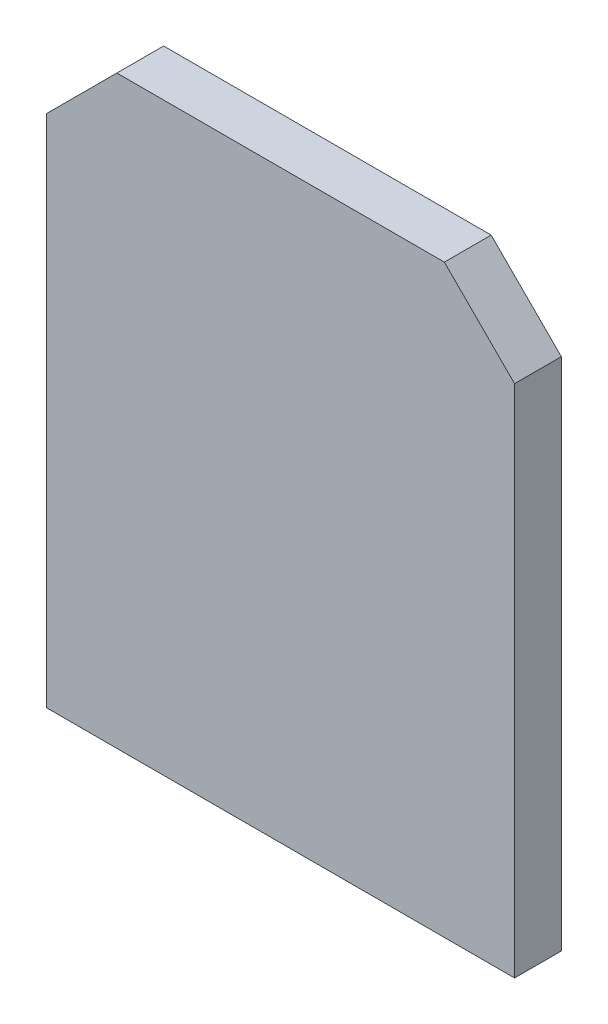
ISO-10303-21;
HEADER;
FILE_DESCRIPTION(('STEP AP214'),'2;1');
FILE_NAME('part.step','',(''),(''),'','','');
FILE_SCHEMA(('AUTOMOTIVE_DESIGN { 1 0 10303 214 1 1 1 1 }'));
ENDSEC;
DATA;
#1=APPLICATION_CONTEXT('core data for automotive mechanical design processes');
#2=APPLICATION_PROTOCOL_DEFINITION('international standard','automotive_design',2000,#1);
#3=PRODUCT_CONTEXT('',#1,'mechanical');
#4=PRODUCT('Part','Part','',(#3));
#5=PRODUCT_RELATED_PRODUCT_CATEGORY('part','',(#4));
#6=PRODUCT_DEFINITION_FORMATION('','',#4);
#7=PRODUCT_DEFINITION_CONTEXT('part definition',#1,'design');
#8=PRODUCT_DEFINITION('design','',#6,#7);
#9=PRODUCT_DEFINITION_SHAPE('','',#8);
#10=(LENGTH_UNIT() NAMED_UNIT(*) SI_UNIT(.MILLI.,.METRE.));
#11=(NAMED_UNIT(*) PLANE_ANGLE_UNIT() SI_UNIT($,.RADIAN.));
#12=(NAMED_UNIT(*) SI_UNIT($,.STERADIAN.) SOLID_ANGLE_UNIT());
#13=UNCERTAINTY_MEASURE_WITH_UNIT(LENGTH_MEASURE(1.E-05),#10,'distance_accuracy_value','');
#14=(GEOMETRIC_REPRESENTATION_CONTEXT(3) GLOBAL_UNCERTAINTY_ASSIGNED_CONTEXT((#13)) GLOBAL_UNIT_ASSIGNED_CONTEXT((#10,
#11,#12)) REPRESENTATION_CONTEXT('',''));
#15=CARTESIAN_POINT('',(0.,0.,0.));
#16=DIRECTION('',(0.,0.,1.));
#17=DIRECTION('',(1.,0.,0.));
#18=AXIS2_PLACEMENT_3D('',#15,#16,#17);
#19=CARTESIAN_POINT('',(-25.4,-31.75,5.08));
#20=DIRECTION('',(1.,0.,0.));
#21=DIRECTION('',(0.,0.,-1.));
#22=AXIS2_PLACEMENT_3D('',#19,#20,#21);
#23=PLANE('',#22);
#24=DIRECTION('',(0.,-1.,0.));
#25=VECTOR('',#24,1.);
#26=CARTESIAN_POINT('',(-25.4,-31.75,0.));
#27=LINE('',#26,#25);
#28=CARTESIAN_POINT('',(-25.4,24.13,0.));
#29=VERTEX_POINT('',#28);
#30=CARTESIAN_POINT('',(-25.4,-31.75,0.));
#31=VERTEX_POINT('',#30);
#32=EDGE_CURVE('E117',#29,#31,#27,.T.);
#33=ORIENTED_EDGE('',*,*,#32,.T.);
#34=DIRECTION('',(0.,0.,-1.));
#35=VECTOR('',#34,1.);
#36=CARTESIAN_POINT('',(-25.4,-31.75,5.08));
#37=LINE('',#36,#35);
#38=CARTESIAN_POINT('',(-25.4,-31.75,5.08));
#39=VERTEX_POINT('',#38);
#40=EDGE_CURVE('E11',#39,#31,#37,.T.);
#41=ORIENTED_EDGE('',*,*,#40,.F.);
#42=DIRECTION('',(0.,-1.,0.));
#43=VECTOR('',#42,1.);
#44=CARTESIAN_POINT('',(-25.4,-31.75,5.08));
#45=LINE('',#44,#43);
#46=CARTESIAN_POINT('',(-25.4,24.13,5.08));
#47=VERTEX_POINT('',#46);
#48=EDGE_CURVE('E127',#47,#39,#45,.T.);
#49=ORIENTED_EDGE('',*,*,#48,.F.);
#50=DIRECTION('',(0.,0.,-1.));
#51=VECTOR('',#50,1.);
#52=CARTESIAN_POINT('',(-25.4,24.13,5.08));
#53=LINE('',#52,#51);
#54=EDGE_CURVE('E113',#47,#29,#53,.T.);
#55=ORIENTED_EDGE('',*,*,#54,.T.);
#56=EDGE_LOOP('',(#33,#41,#49,#55));
#57=FACE_BOUND('',#56,.T.);
#58=ADVANCED_FACE('F33',(#57),#23,.F.);
#59=CARTESIAN_POINT('',(-25.4,-31.75,5.08));
#60=DIRECTION('',(0.,1.,0.));
#61=DIRECTION('',(0.,0.,1.));
#62=AXIS2_PLACEMENT_3D('',#59,#60,#61);
#63=PLANE('',#62);
#64=DIRECTION('',(1.,0.,0.));
#65=VECTOR('',#64,1.);
#66=CARTESIAN_POINT('',(-25.4,-31.75,0.));
#67=LINE('',#66,#65);
#68=CARTESIAN_POINT('',(25.4,-31.75,0.));
#69=VERTEX_POINT('',#68);
#70=EDGE_CURVE('E120',#31,#69,#67,.T.);
#71=ORIENTED_EDGE('',*,*,#70,.T.);
#72=DIRECTION('',(0.,0.,-1.));
#73=VECTOR('',#72,1.);
#74=CARTESIAN_POINT('',(25.4,-31.75,5.08));
#75=LINE('',#74,#73);
#76=CARTESIAN_POINT('',(25.4,-31.75,5.08));
#77=VERTEX_POINT('',#76);
#78=EDGE_CURVE('E41',#77,#69,#75,.T.);
#79=ORIENTED_EDGE('',*,*,#78,.F.);
#80=DIRECTION('',(1.,0.,0.));
#81=VECTOR('',#80,1.);
#82=CARTESIAN_POINT('',(-25.4,-31.75,5.08));
#83=LINE('',#82,#81);
#84=EDGE_CURVE('E86',#39,#77,#83,.T.);
#85=ORIENTED_EDGE('',*,*,#84,.F.);
#86=ORIENTED_EDGE('',*,*,#40,.T.);
#87=EDGE_LOOP('',(#71,#79,#85,#86));
#88=FACE_BOUND('',#87,.T.);
#89=ADVANCED_FACE('F151',(#88),#63,.F.);
#90=CARTESIAN_POINT('',(25.4,-31.75,5.08));
#91=DIRECTION('',(-1.,0.,0.));
#92=DIRECTION('',(0.,0.,1.));
#93=AXIS2_PLACEMENT_3D('',#90,#91,#92);
#94=PLANE('',#93);
#95=DIRECTION('',(0.,1.,0.));
#96=VECTOR('',#95,1.);
#97=CARTESIAN_POINT('',(25.4,-31.75,0.));
#98=LINE('',#97,#96);
#99=CARTESIAN_POINT('',(25.4,24.13,0.));
#100=VERTEX_POINT('',#99);
#101=EDGE_CURVE('E122',#69,#100,#98,.T.);
#102=ORIENTED_EDGE('',*,*,#101,.T.);
#103=DIRECTION('',(0.,0.,-1.));
#104=VECTOR('',#103,1.);
#105=CARTESIAN_POINT('',(25.4,24.13,5.08));
#106=LINE('',#105,#104);
#107=CARTESIAN_POINT('',(25.4,24.13,5.08));
#108=VERTEX_POINT('',#107);
#109=EDGE_CURVE('E108',#108,#100,#106,.T.);
#110=ORIENTED_EDGE('',*,*,#109,.F.);
#111=DIRECTION('',(0.,1.,0.));
#112=VECTOR('',#111,1.);
#113=CARTESIAN_POINT('',(25.4,-31.75,5.08));
#114=LINE('',#113,#112);
#115=EDGE_CURVE('E99',#77,#108,#114,.T.);
#116=ORIENTED_EDGE('',*,*,#115,.F.);
#117=ORIENTED_EDGE('',*,*,#78,.T.);
#118=EDGE_LOOP('',(#102,#110,#116,#117));
#119=FACE_BOUND('',#118,.T.);
#120=ADVANCED_FACE('F133',(#119),#94,.F.);
#121=CARTESIAN_POINT('',(17.78,31.75,5.08));
#122=DIRECTION('',(-0.707106781186548,-0.707106781186548,0.));
#123=DIRECTION('',(0.707106781186548,-0.707106781186548,0.));
#124=AXIS2_PLACEMENT_3D('',#121,#122,#123);
#125=PLANE('',#124);
#126=DIRECTION('',(-0.707106781186547,0.707106781186547,0.));
#127=VECTOR('',#126,1.);
#128=CARTESIAN_POINT('',(17.78,31.75,0.));
#129=LINE('',#128,#127);
#130=CARTESIAN_POINT('',(17.78,31.75,0.));
#131=VERTEX_POINT('',#130);
#132=EDGE_CURVE('E107',#100,#131,#129,.T.);
#133=ORIENTED_EDGE('',*,*,#132,.T.);
#134=DIRECTION('',(0.,0.,-1.));
#135=VECTOR('',#134,1.);
#136=CARTESIAN_POINT('',(17.78,31.75,5.08));
#137=LINE('',#136,#135);
#138=CARTESIAN_POINT('',(17.78,31.75,5.08));
#139=VERTEX_POINT('',#138);
#140=EDGE_CURVE('E104',#139,#131,#137,.T.);
#141=ORIENTED_EDGE('',*,*,#140,.F.);
#142=DIRECTION('',(-0.707106781186547,0.707106781186547,0.));
#143=VECTOR('',#142,1.);
#144=CARTESIAN_POINT('',(17.78,31.75,5.08));
#145=LINE('',#144,#143);
#146=EDGE_CURVE('E93',#108,#139,#145,.T.);
#147=ORIENTED_EDGE('',*,*,#146,.F.);
#148=ORIENTED_EDGE('',*,*,#109,.T.);
#149=EDGE_LOOP('',(#133,#141,#147,#148));
#150=FACE_BOUND('',#149,.T.);
#151=ADVANCED_FACE('F105',(#150),#125,.F.);
#152=CARTESIAN_POINT('',(-17.78,31.75,5.08));
#153=DIRECTION('',(0.,-1.,0.));
#154=DIRECTION('',(0.,0.,-1.));
#155=AXIS2_PLACEMENT_3D('',#152,#153,#154);
#156=PLANE('',#155);
#157=DIRECTION('',(-1.,0.,0.));
#158=VECTOR('',#157,1.);
#159=CARTESIAN_POINT('',(-17.78,31.75,0.));
#160=LINE('',#159,#158);
#161=CARTESIAN_POINT('',(-17.78,31.75,0.));
#162=VERTEX_POINT('',#161);
#163=EDGE_CURVE('E72',#131,#162,#160,.T.);
#164=ORIENTED_EDGE('',*,*,#163,.T.);
#165=DIRECTION('',(0.,0.,-1.));
#166=VECTOR('',#165,1.);
#167=CARTESIAN_POINT('',(-17.78,31.75,5.08));
#168=LINE('',#167,#166);
#169=CARTESIAN_POINT('',(-17.78,31.75,5.08));
#170=VERTEX_POINT('',#169);
#171=EDGE_CURVE('E109',#170,#162,#168,.T.);
#172=ORIENTED_EDGE('',*,*,#171,.F.);
#173=DIRECTION('',(-1.,0.,0.));
#174=VECTOR('',#173,1.);
#175=CARTESIAN_POINT('',(-17.78,31.75,5.08));
#176=LINE('',#175,#174);
#177=EDGE_CURVE('E97',#139,#170,#176,.T.);
#178=ORIENTED_EDGE('',*,*,#177,.F.);
#179=ORIENTED_EDGE('',*,*,#140,.T.);
#180=EDGE_LOOP('',(#164,#172,#178,#179));
#181=FACE_BOUND('',#180,.T.);
#182=ADVANCED_FACE('F111',(#181),#156,.F.);
#183=CARTESIAN_POINT('',(-25.4,24.13,5.08));
#184=DIRECTION('',(0.707106781186548,-0.707106781186548,0.));
#185=DIRECTION('',(0.707106781186548,0.707106781186548,0.));
#186=AXIS2_PLACEMENT_3D('',#183,#184,#185);
#187=PLANE('',#186);
#188=DIRECTION('',(-0.707106781186547,-0.707106781186547,0.));
#189=VECTOR('',#188,1.);
#190=CARTESIAN_POINT('',(-25.4,24.13,0.));
#191=LINE('',#190,#189);
#192=EDGE_CURVE('E78',#162,#29,#191,.T.);
#193=ORIENTED_EDGE('',*,*,#192,.T.);
#194=ORIENTED_EDGE('',*,*,#54,.F.);
#195=DIRECTION('',(-0.707106781186547,-0.707106781186547,0.));
#196=VECTOR('',#195,1.);
#197=CARTESIAN_POINT('',(-25.4,24.13,5.08));
#198=LINE('',#197,#196);
#199=EDGE_CURVE('E49',#170,#47,#198,.T.);
#200=ORIENTED_EDGE('',*,*,#199,.F.);
#201=ORIENTED_EDGE('',*,*,#171,.T.);
#202=EDGE_LOOP('',(#193,#194,#200,#201));
#203=FACE_BOUND('',#202,.T.);
#204=ADVANCED_FACE('F140',(#203),#187,.F.);
#205=CARTESIAN_POINT('',(0.,0.,5.08));
#206=DIRECTION('',(0.,0.,-1.));
#207=DIRECTION('',(-1.,0.,0.));
#208=AXIS2_PLACEMENT_3D('',#205,#206,#207);
#209=PLANE('',#208);
#210=ORIENTED_EDGE('',*,*,#48,.T.);
#211=ORIENTED_EDGE('',*,*,#84,.T.);
#212=ORIENTED_EDGE('',*,*,#115,.T.);
#213=ORIENTED_EDGE('',*,*,#146,.T.);
#214=ORIENTED_EDGE('',*,*,#177,.T.);
#215=ORIENTED_EDGE('',*,*,#199,.T.);
#216=EDGE_LOOP('',(#210,#211,#212,#213,#214,#215));
#217=FACE_BOUND('',#216,.T.);
#218=ADVANCED_FACE('F95',(#217),#209,.F.);
#219=CARTESIAN_POINT('',(0.,0.,0.));
#220=DIRECTION('',(0.,0.,-1.));
#221=DIRECTION('',(-1.,0.,0.));
#222=AXIS2_PLACEMENT_3D('',#219,#220,#221);
#223=PLANE('',#222);
#224=ORIENTED_EDGE('',*,*,#32,.F.);
#225=ORIENTED_EDGE('',*,*,#192,.F.);
#226=ORIENTED_EDGE('',*,*,#163,.F.);
#227=ORIENTED_EDGE('',*,*,#132,.F.);
#228=ORIENTED_EDGE('',*,*,#101,.F.);
#229=ORIENTED_EDGE('',*,*,#70,.F.);
#230=EDGE_LOOP('',(#224,#225,#226,#227,#228,#229));
#231=FACE_BOUND('',#230,.T.);
#232=ADVANCED_FACE('F136',(#231),#223,.T.);
#233=CLOSED_SHELL('',(#58,#89,#120,#151,#182,#204,#218,#232));
#234=MANIFOLD_SOLID_BREP('B2',#233);
#235=ADVANCED_BREP_SHAPE_REPRESENTATION('',(#18,#234),#14);
#236=SHAPE_DEFINITION_REPRESENTATION(#9,#235);
ENDSEC;
END-ISO-10303-21;
